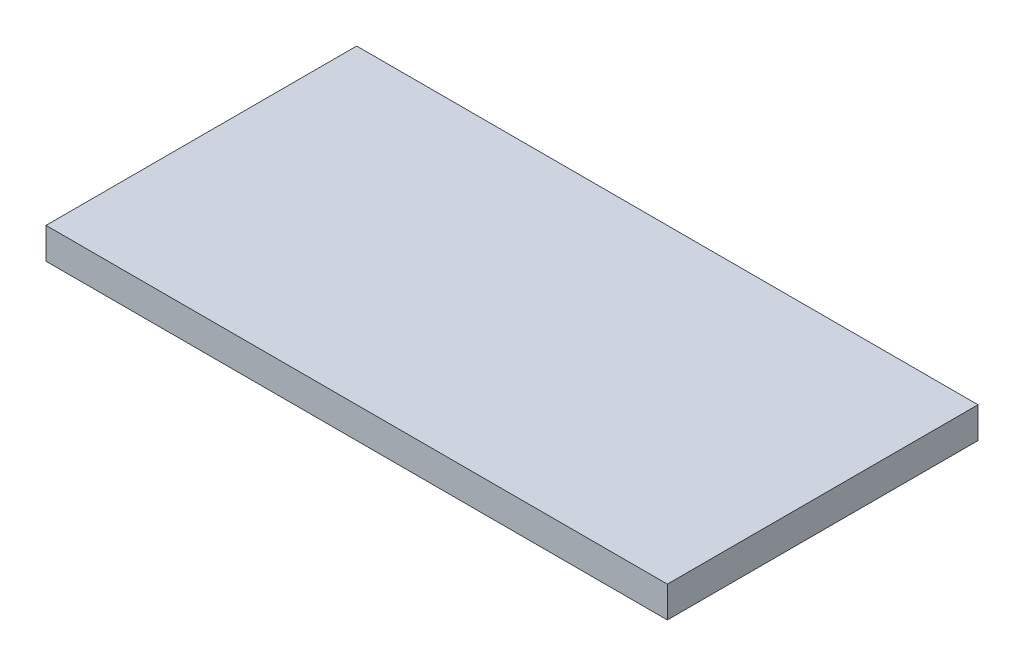
ISO-10303-21;
HEADER;
FILE_DESCRIPTION(('STEP AP214'),'2;1');
FILE_NAME('part.step','',(''),(''),'','','');
FILE_SCHEMA(('AUTOMOTIVE_DESIGN { 1 0 10303 214 1 1 1 1 }'));
ENDSEC;
DATA;
#1=APPLICATION_CONTEXT('core data for automotive mechanical design processes');
#2=APPLICATION_PROTOCOL_DEFINITION('international standard','automotive_design',2000,#1);
#3=PRODUCT_CONTEXT('',#1,'mechanical');
#4=PRODUCT('Part','Part','',(#3));
#5=PRODUCT_RELATED_PRODUCT_CATEGORY('part','',(#4));
#6=PRODUCT_DEFINITION_FORMATION('','',#4);
#7=PRODUCT_DEFINITION_CONTEXT('part definition',#1,'design');
#8=PRODUCT_DEFINITION('design','',#6,#7);
#9=PRODUCT_DEFINITION_SHAPE('','',#8);
#10=(LENGTH_UNIT() NAMED_UNIT(*) SI_UNIT(.MILLI.,.METRE.));
#11=(NAMED_UNIT(*) PLANE_ANGLE_UNIT() SI_UNIT($,.RADIAN.));
#12=(NAMED_UNIT(*) SI_UNIT($,.STERADIAN.) SOLID_ANGLE_UNIT());
#13=UNCERTAINTY_MEASURE_WITH_UNIT(LENGTH_MEASURE(1.E-05),#10,'distance_accuracy_value','');
#14=(GEOMETRIC_REPRESENTATION_CONTEXT(3) GLOBAL_UNCERTAINTY_ASSIGNED_CONTEXT((#13)) GLOBAL_UNIT_ASSIGNED_CONTEXT((#10,
#11,#12)) REPRESENTATION_CONTEXT('',''));
#15=CARTESIAN_POINT('',(0.,0.,0.));
#16=DIRECTION('',(0.,0.,1.));
#17=DIRECTION('',(1.,0.,0.));
#18=AXIS2_PLACEMENT_3D('',#15,#16,#17);
#19=CARTESIAN_POINT('',(-1.84049079754605,10.,0.));
#20=DIRECTION('',(1.,0.,0.));
#21=DIRECTION('',(0.,0.,-1.));
#22=AXIS2_PLACEMENT_3D('',#19,#20,#21);
#23=PLANE('',#22);
#24=DIRECTION('',(0.,0.,1.));
#25=VECTOR('',#24,1.);
#26=CARTESIAN_POINT('',(-1.84049079754605,0.,0.));
#27=LINE('',#26,#25);
#28=CARTESIAN_POINT('',(-1.84049079754605,0.,0.));
#29=VERTEX_POINT('',#28);
#30=CARTESIAN_POINT('',(-1.84049079754603,0.,100.));
#31=VERTEX_POINT('',#30);
#32=EDGE_CURVE('E111',#29,#31,#27,.T.);
#33=ORIENTED_EDGE('',*,*,#32,.T.);
#34=DIRECTION('',(0.,-1.,0.));
#35=VECTOR('',#34,1.);
#36=CARTESIAN_POINT('',(-1.84049079754603,10.,100.));
#37=LINE('',#36,#35);
#38=CARTESIAN_POINT('',(-1.84049079754603,10.,100.));
#39=VERTEX_POINT('',#38);
#40=EDGE_CURVE('E11',#39,#31,#37,.T.);
#41=ORIENTED_EDGE('',*,*,#40,.F.);
#42=DIRECTION('',(0.,0.,1.));
#43=VECTOR('',#42,1.);
#44=CARTESIAN_POINT('',(-1.84049079754605,10.,0.));
#45=LINE('',#44,#43);
#46=CARTESIAN_POINT('',(-1.84049079754605,10.,0.));
#47=VERTEX_POINT('',#46);
#48=EDGE_CURVE('E93',#47,#39,#45,.T.);
#49=ORIENTED_EDGE('',*,*,#48,.F.);
#50=DIRECTION('',(0.,-1.,0.));
#51=VECTOR('',#50,1.);
#52=CARTESIAN_POINT('',(-1.84049079754605,10.,0.));
#53=LINE('',#52,#51);
#54=EDGE_CURVE('E60',#47,#29,#53,.T.);
#55=ORIENTED_EDGE('',*,*,#54,.T.);
#56=EDGE_LOOP('',(#33,#41,#49,#55));
#57=FACE_BOUND('',#56,.T.);
#58=ADVANCED_FACE('F43',(#57),#23,.F.);
#59=CARTESIAN_POINT('',(-1.84049079754603,10.,100.));
#60=DIRECTION('',(0.,0.,-1.));
#61=DIRECTION('',(-1.,0.,0.));
#62=AXIS2_PLACEMENT_3D('',#59,#60,#61);
#63=PLANE('',#62);
#64=DIRECTION('',(1.,0.,0.));
#65=VECTOR('',#64,1.);
#66=CARTESIAN_POINT('',(-1.84049079754603,0.,100.));
#67=LINE('',#66,#65);
#68=CARTESIAN_POINT('',(198.159509202454,0.,100.));
#69=VERTEX_POINT('',#68);
#70=EDGE_CURVE('E99',#31,#69,#67,.T.);
#71=ORIENTED_EDGE('',*,*,#70,.T.);
#72=DIRECTION('',(0.,-1.,0.));
#73=VECTOR('',#72,1.);
#74=CARTESIAN_POINT('',(198.159509202454,10.,100.));
#75=LINE('',#74,#73);
#76=CARTESIAN_POINT('',(198.159509202454,10.,100.));
#77=VERTEX_POINT('',#76);
#78=EDGE_CURVE('E52',#77,#69,#75,.T.);
#79=ORIENTED_EDGE('',*,*,#78,.F.);
#80=DIRECTION('',(1.,0.,0.));
#81=VECTOR('',#80,1.);
#82=CARTESIAN_POINT('',(-1.84049079754603,10.,100.));
#83=LINE('',#82,#81);
#84=EDGE_CURVE('E85',#39,#77,#83,.T.);
#85=ORIENTED_EDGE('',*,*,#84,.F.);
#86=ORIENTED_EDGE('',*,*,#40,.T.);
#87=EDGE_LOOP('',(#71,#79,#85,#86));
#88=FACE_BOUND('',#87,.T.);
#89=ADVANCED_FACE('F98',(#88),#63,.F.);
#90=CARTESIAN_POINT('',(198.159509202454,10.,0.));
#91=DIRECTION('',(1.,0.,0.));
#92=DIRECTION('',(0.,0.,-1.));
#93=AXIS2_PLACEMENT_3D('',#90,#91,#92);
#94=PLANE('',#93);
#95=DIRECTION('',(0.,0.,1.));
#96=VECTOR('',#95,1.);
#97=CARTESIAN_POINT('',(198.159509202454,0.,0.));
#98=LINE('',#97,#96);
#99=CARTESIAN_POINT('',(198.159509202454,0.,0.));
#100=VERTEX_POINT('',#99);
#101=EDGE_CURVE('E116',#100,#69,#98,.T.);
#102=ORIENTED_EDGE('',*,*,#101,.F.);
#103=DIRECTION('',(0.,-1.,0.));
#104=VECTOR('',#103,1.);
#105=CARTESIAN_POINT('',(198.159509202454,10.,0.));
#106=LINE('',#105,#104);
#107=CARTESIAN_POINT('',(198.159509202454,10.,0.));
#108=VERTEX_POINT('',#107);
#109=EDGE_CURVE('E74',#108,#100,#106,.T.);
#110=ORIENTED_EDGE('',*,*,#109,.F.);
#111=DIRECTION('',(0.,0.,1.));
#112=VECTOR('',#111,1.);
#113=CARTESIAN_POINT('',(198.159509202454,10.,0.));
#114=LINE('',#113,#112);
#115=EDGE_CURVE('E92',#108,#77,#114,.T.);
#116=ORIENTED_EDGE('',*,*,#115,.T.);
#117=ORIENTED_EDGE('',*,*,#78,.T.);
#118=EDGE_LOOP('',(#102,#110,#116,#117));
#119=FACE_BOUND('',#118,.T.);
#120=ADVANCED_FACE('F103',(#119),#94,.T.);
#121=CARTESIAN_POINT('',(-1.84049079754605,10.,0.));
#122=DIRECTION('',(0.,0.,-1.));
#123=DIRECTION('',(-1.,0.,0.));
#124=AXIS2_PLACEMENT_3D('',#121,#122,#123);
#125=PLANE('',#124);
#126=DIRECTION('',(1.,0.,0.));
#127=VECTOR('',#126,1.);
#128=CARTESIAN_POINT('',(-1.84049079754605,0.,0.));
#129=LINE('',#128,#127);
#130=EDGE_CURVE('E119',#29,#100,#129,.T.);
#131=ORIENTED_EDGE('',*,*,#130,.F.);
#132=ORIENTED_EDGE('',*,*,#54,.F.);
#133=DIRECTION('',(1.,0.,0.));
#134=VECTOR('',#133,1.);
#135=CARTESIAN_POINT('',(-1.84049079754605,10.,0.));
#136=LINE('',#135,#134);
#137=EDGE_CURVE('E105',#47,#108,#136,.T.);
#138=ORIENTED_EDGE('',*,*,#137,.T.);
#139=ORIENTED_EDGE('',*,*,#109,.T.);
#140=EDGE_LOOP('',(#131,#132,#138,#139));
#141=FACE_BOUND('',#140,.T.);
#142=ADVANCED_FACE('F129',(#141),#125,.T.);
#143=CARTESIAN_POINT('',(0.,10.,0.));
#144=DIRECTION('',(0.,1.,0.));
#145=DIRECTION('',(0.,0.,1.));
#146=AXIS2_PLACEMENT_3D('',#143,#144,#145);
#147=PLANE('',#146);
#148=ORIENTED_EDGE('',*,*,#48,.T.);
#149=ORIENTED_EDGE('',*,*,#84,.T.);
#150=ORIENTED_EDGE('',*,*,#115,.F.);
#151=ORIENTED_EDGE('',*,*,#137,.F.);
#152=EDGE_LOOP('',(#148,#149,#150,#151));
#153=FACE_BOUND('',#152,.T.);
#154=ADVANCED_FACE('F89',(#153),#147,.T.);
#155=CARTESIAN_POINT('',(0.,0.,0.));
#156=DIRECTION('',(0.,1.,0.));
#157=DIRECTION('',(0.,0.,1.));
#158=AXIS2_PLACEMENT_3D('',#155,#156,#157);
#159=PLANE('',#158);
#160=ORIENTED_EDGE('',*,*,#32,.F.);
#161=ORIENTED_EDGE('',*,*,#130,.T.);
#162=ORIENTED_EDGE('',*,*,#101,.T.);
#163=ORIENTED_EDGE('',*,*,#70,.F.);
#164=EDGE_LOOP('',(#160,#161,#162,#163));
#165=FACE_BOUND('',#164,.T.);
#166=ADVANCED_FACE('F128',(#165),#159,.F.);
#167=CLOSED_SHELL('',(#58,#89,#120,#142,#154,#166));
#168=MANIFOLD_SOLID_BREP('B2',#167);
#169=ADVANCED_BREP_SHAPE_REPRESENTATION('',(#18,#168),#14);
#170=SHAPE_DEFINITION_REPRESENTATION(#9,#169);
ENDSEC;
END-ISO-10303-21;
